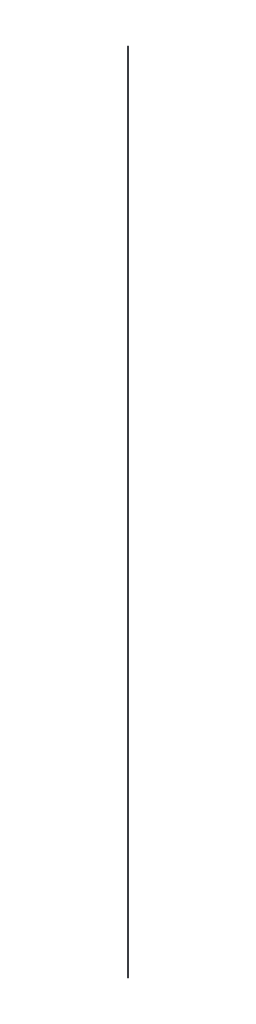
ISO-10303-21;
HEADER;
FILE_DESCRIPTION(('STEP AP214'),'2;1');
FILE_NAME('part.step','',(''),(''),'','','');
FILE_SCHEMA(('AUTOMOTIVE_DESIGN { 1 0 10303 214 1 1 1 1 }'));
ENDSEC;
DATA;
#1=APPLICATION_CONTEXT('core data for automotive mechanical design processes');
#2=APPLICATION_PROTOCOL_DEFINITION('international standard','automotive_design',2000,#1);
#3=PRODUCT_CONTEXT('',#1,'mechanical');
#4=PRODUCT('Part','Part','',(#3));
#5=PRODUCT_RELATED_PRODUCT_CATEGORY('part','',(#4));
#6=PRODUCT_DEFINITION_FORMATION('','',#4);
#7=PRODUCT_DEFINITION_CONTEXT('part definition',#1,'design');
#8=PRODUCT_DEFINITION('design','',#6,#7);
#9=PRODUCT_DEFINITION_SHAPE('','',#8);
#10=(LENGTH_UNIT() NAMED_UNIT(*) SI_UNIT(.MILLI.,.METRE.));
#11=(NAMED_UNIT(*) PLANE_ANGLE_UNIT() SI_UNIT($,.RADIAN.));
#12=(NAMED_UNIT(*) SI_UNIT($,.STERADIAN.) SOLID_ANGLE_UNIT());
#13=UNCERTAINTY_MEASURE_WITH_UNIT(LENGTH_MEASURE(1.E-05),#10,'distance_accuracy_value','');
#14=(GEOMETRIC_REPRESENTATION_CONTEXT(3) GLOBAL_UNCERTAINTY_ASSIGNED_CONTEXT((#13)) GLOBAL_UNIT_ASSIGNED_CONTEXT((#10,
#11,#12)) REPRESENTATION_CONTEXT('',''));
#15=CARTESIAN_POINT('',(0.,0.,0.));
#16=DIRECTION('',(0.,0.,1.));
#17=DIRECTION('',(1.,0.,0.));
#18=AXIS2_PLACEMENT_3D('',#15,#16,#17);
#19=CARTESIAN_POINT('',(0.,3000.,0.));
#20=DIRECTION('',(0.,-1.,0.));
#21=DIRECTION('',(0.,0.,-1.));
#22=AXIS2_PLACEMENT_3D('',#19,#20,#21);
#23=CYLINDRICAL_SURFACE('',#22,1.);
#24=CARTESIAN_POINT('',(0.,3000.,0.));
#25=DIRECTION('',(0.,1.,0.));
#26=DIRECTION('',(0.,0.,1.));
#27=AXIS2_PLACEMENT_3D('',#24,#25,#26);
#28=CIRCLE('',#27,1.);
#29=CARTESIAN_POINT('',(0.,3000.,1.));
#30=VERTEX_POINT('',#29);
#31=EDGE_CURVE('E10',#30,#30,#28,.T.);
#32=ORIENTED_EDGE('',*,*,#31,.F.);
#33=EDGE_LOOP('',(#32));
#34=FACE_BOUND('',#33,.T.);
#35=CARTESIAN_POINT('',(0.,0.,0.));
#36=DIRECTION('',(0.,1.,0.));
#37=DIRECTION('',(0.,0.,1.));
#38=AXIS2_PLACEMENT_3D('',#35,#36,#37);
#39=CIRCLE('',#38,1.);
#40=CARTESIAN_POINT('',(0.,0.,1.));
#41=VERTEX_POINT('',#40);
#42=EDGE_CURVE('E38',#41,#41,#39,.T.);
#43=ORIENTED_EDGE('',*,*,#42,.T.);
#44=EDGE_LOOP('',(#43));
#45=FACE_BOUND('',#44,.T.);
#46=ADVANCED_FACE('F35',(#34,#45),#23,.T.);
#47=CARTESIAN_POINT('',(0.,3000.,0.));
#48=DIRECTION('',(0.,1.,0.));
#49=DIRECTION('',(0.,0.,1.));
#50=AXIS2_PLACEMENT_3D('',#47,#48,#49);
#51=PLANE('',#50);
#52=ORIENTED_EDGE('',*,*,#31,.T.);
#53=EDGE_LOOP('',(#52));
#54=FACE_BOUND('',#53,.T.);
#55=ADVANCED_FACE('F52',(#54),#51,.T.);
#56=CARTESIAN_POINT('',(0.,0.,0.));
#57=DIRECTION('',(0.,1.,0.));
#58=DIRECTION('',(0.,0.,1.));
#59=AXIS2_PLACEMENT_3D('',#56,#57,#58);
#60=PLANE('',#59);
#61=ORIENTED_EDGE('',*,*,#42,.F.);
#62=EDGE_LOOP('',(#61));
#63=FACE_BOUND('',#62,.T.);
#64=ADVANCED_FACE('F50',(#63),#60,.F.);
#65=CLOSED_SHELL('',(#46,#55,#64));
#66=MANIFOLD_SOLID_BREP('B2',#65);
#67=ADVANCED_BREP_SHAPE_REPRESENTATION('',(#18,#66),#14);
#68=SHAPE_DEFINITION_REPRESENTATION(#9,#67);
ENDSEC;
END-ISO-10303-21;
